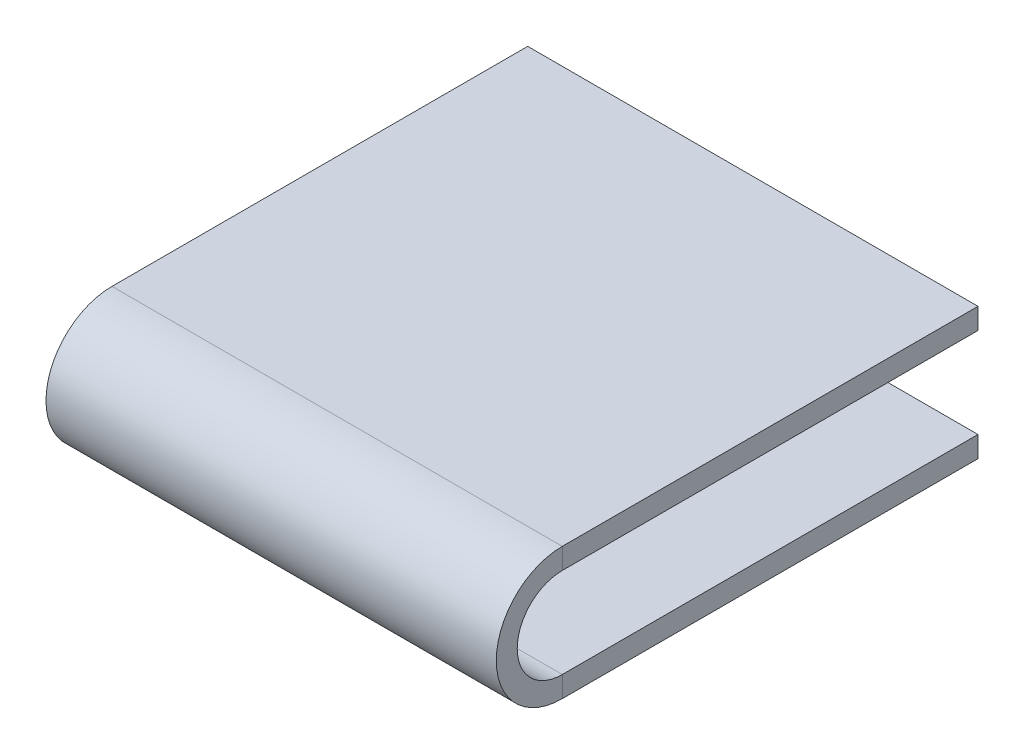
ISO-10303-21;
HEADER;
FILE_DESCRIPTION(('STEP AP214'),'2;1');
FILE_NAME('part.step','',(''),(''),'','','');
FILE_SCHEMA(('AUTOMOTIVE_DESIGN { 1 0 10303 214 1 1 1 1 }'));
ENDSEC;
DATA;
#1=APPLICATION_CONTEXT('core data for automotive mechanical design processes');
#2=APPLICATION_PROTOCOL_DEFINITION('international standard','automotive_design',2000,#1);
#3=PRODUCT_CONTEXT('',#1,'mechanical');
#4=PRODUCT('Part','Part','',(#3));
#5=PRODUCT_RELATED_PRODUCT_CATEGORY('part','',(#4));
#6=PRODUCT_DEFINITION_FORMATION('','',#4);
#7=PRODUCT_DEFINITION_CONTEXT('part definition',#1,'design');
#8=PRODUCT_DEFINITION('design','',#6,#7);
#9=PRODUCT_DEFINITION_SHAPE('','',#8);
#10=(LENGTH_UNIT() NAMED_UNIT(*) SI_UNIT(.MILLI.,.METRE.));
#11=(NAMED_UNIT(*) PLANE_ANGLE_UNIT() SI_UNIT($,.RADIAN.));
#12=(NAMED_UNIT(*) SI_UNIT($,.STERADIAN.) SOLID_ANGLE_UNIT());
#13=UNCERTAINTY_MEASURE_WITH_UNIT(LENGTH_MEASURE(1.E-05),#10,'distance_accuracy_value','');
#14=(GEOMETRIC_REPRESENTATION_CONTEXT(3) GLOBAL_UNCERTAINTY_ASSIGNED_CONTEXT((#13)) GLOBAL_UNIT_ASSIGNED_CONTEXT((#10,
#11,#12)) REPRESENTATION_CONTEXT('',''));
#15=CARTESIAN_POINT('',(0.,0.,0.));
#16=DIRECTION('',(0.,0.,1.));
#17=DIRECTION('',(1.,0.,0.));
#18=AXIS2_PLACEMENT_3D('',#15,#16,#17);
#19=CARTESIAN_POINT('',(21.5,0.,19.85));
#20=DIRECTION('',(1.,0.,0.));
#21=DIRECTION('',(0.,0.,-1.));
#22=AXIS2_PLACEMENT_3D('',#19,#20,#21);
#23=PLANE('',#22);
#24=DIRECTION('',(0.,-1.,0.));
#25=VECTOR('',#24,1.);
#26=CARTESIAN_POINT('',(21.5,0.,19.85));
#27=LINE('',#26,#25);
#28=CARTESIAN_POINT('',(21.5,0.,19.85));
#29=VERTEX_POINT('',#28);
#30=CARTESIAN_POINT('',(21.5,-1.,19.85));
#31=VERTEX_POINT('',#30);
#32=EDGE_CURVE('E11',#29,#31,#27,.T.);
#33=ORIENTED_EDGE('',*,*,#32,.F.);
#34=CARTESIAN_POINT('',(21.5,2.15,19.85));
#35=DIRECTION('',(1.,0.,0.));
#36=DIRECTION('',(0.,0.,-1.));
#37=AXIS2_PLACEMENT_3D('',#34,#35,#36);
#38=CIRCLE('',#37,2.15);
#39=CARTESIAN_POINT('',(21.5,4.29999999999999,19.85));
#40=VERTEX_POINT('',#39);
#41=EDGE_CURVE('E139',#40,#29,#38,.T.);
#42=ORIENTED_EDGE('',*,*,#41,.F.);
#43=DIRECTION('',(0.,-1.,0.));
#44=VECTOR('',#43,1.);
#45=CARTESIAN_POINT('',(21.5,5.29999999999999,19.85));
#46=LINE('',#45,#44);
#47=CARTESIAN_POINT('',(21.5,5.29999999999999,19.85));
#48=VERTEX_POINT('',#47);
#49=EDGE_CURVE('E51',#48,#40,#46,.T.);
#50=ORIENTED_EDGE('',*,*,#49,.F.);
#51=CARTESIAN_POINT('',(21.5,2.15,19.85));
#52=DIRECTION('',(1.,0.,0.));
#53=DIRECTION('',(0.,1.,0.));
#54=AXIS2_PLACEMENT_3D('',#51,#52,#53);
#55=CIRCLE('',#54,3.15);
#56=EDGE_CURVE('E132',#48,#31,#55,.T.);
#57=ORIENTED_EDGE('',*,*,#56,.T.);
#58=EDGE_LOOP('',(#33,#42,#50,#57));
#59=FACE_BOUND('',#58,.T.);
#60=ADVANCED_FACE('F43',(#59),#23,.T.);
#61=CARTESIAN_POINT('',(21.5,5.29999999999999,19.85));
#62=DIRECTION('',(1.,0.,0.));
#63=DIRECTION('',(0.,0.,-1.));
#64=AXIS2_PLACEMENT_3D('',#61,#62,#63);
#65=PLANE('',#64);
#66=DIRECTION('',(0.,0.,-1.));
#67=VECTOR('',#66,1.);
#68=CARTESIAN_POINT('',(21.5,0.,0.));
#69=LINE('',#68,#67);
#70=CARTESIAN_POINT('',(21.5,0.,0.));
#71=VERTEX_POINT('',#70);
#72=EDGE_CURVE('E188',#29,#71,#69,.T.);
#73=ORIENTED_EDGE('',*,*,#72,.F.);
#74=ORIENTED_EDGE('',*,*,#32,.T.);
#75=DIRECTION('',(0.,0.,1.));
#76=VECTOR('',#75,1.);
#77=CARTESIAN_POINT('',(21.5,-1.,0.));
#78=LINE('',#77,#76);
#79=CARTESIAN_POINT('',(21.5,-1.,0.));
#80=VERTEX_POINT('',#79);
#81=EDGE_CURVE('E97',#31,#80,#78,.F.);
#82=ORIENTED_EDGE('',*,*,#81,.T.);
#83=DIRECTION('',(0.,-1.,0.));
#84=VECTOR('',#83,1.);
#85=CARTESIAN_POINT('',(21.5,0.,0.));
#86=LINE('',#85,#84);
#87=EDGE_CURVE('E347',#71,#80,#86,.T.);
#88=ORIENTED_EDGE('',*,*,#87,.F.);
#89=EDGE_LOOP('',(#73,#74,#82,#88));
#90=FACE_BOUND('',#89,.T.);
#91=ADVANCED_FACE('F197',(#90),#65,.T.);
#92=CARTESIAN_POINT('',(0.,4.29999999999999,19.85));
#93=DIRECTION('',(-1.,0.,0.));
#94=DIRECTION('',(0.,0.,1.));
#95=AXIS2_PLACEMENT_3D('',#92,#93,#94);
#96=PLANE('',#95);
#97=DIRECTION('',(0.,1.,0.));
#98=VECTOR('',#97,1.);
#99=CARTESIAN_POINT('',(0.,4.29999999999999,19.85));
#100=LINE('',#99,#98);
#101=CARTESIAN_POINT('',(0.,4.29999999999999,19.85));
#102=VERTEX_POINT('',#101);
#103=CARTESIAN_POINT('',(0.,5.29999999999999,19.85));
#104=VERTEX_POINT('',#103);
#105=EDGE_CURVE('E88',#102,#104,#100,.T.);
#106=ORIENTED_EDGE('',*,*,#105,.F.);
#107=CARTESIAN_POINT('',(0.,2.15,19.85));
#108=DIRECTION('',(1.,0.,0.));
#109=DIRECTION('',(0.,0.,-1.));
#110=AXIS2_PLACEMENT_3D('',#107,#108,#109);
#111=CIRCLE('',#110,2.15);
#112=CARTESIAN_POINT('',(0.,0.,19.85));
#113=VERTEX_POINT('',#112);
#114=EDGE_CURVE('E154',#102,#113,#111,.T.);
#115=ORIENTED_EDGE('',*,*,#114,.T.);
#116=DIRECTION('',(0.,1.,0.));
#117=VECTOR('',#116,1.);
#118=CARTESIAN_POINT('',(0.,-1.,19.85));
#119=LINE('',#118,#117);
#120=CARTESIAN_POINT('',(0.,-1.,19.85));
#121=VERTEX_POINT('',#120);
#122=EDGE_CURVE('E91',#121,#113,#119,.T.);
#123=ORIENTED_EDGE('',*,*,#122,.F.);
#124=CARTESIAN_POINT('',(0.,2.15,19.85));
#125=DIRECTION('',(1.,0.,0.));
#126=DIRECTION('',(0.,1.,0.));
#127=AXIS2_PLACEMENT_3D('',#124,#125,#126);
#128=CIRCLE('',#127,3.15);
#129=EDGE_CURVE('E165',#104,#121,#128,.T.);
#130=ORIENTED_EDGE('',*,*,#129,.F.);
#131=EDGE_LOOP('',(#106,#115,#123,#130));
#132=FACE_BOUND('',#131,.T.);
#133=ADVANCED_FACE('F194',(#132),#96,.T.);
#134=CARTESIAN_POINT('',(0.,-1.,19.85));
#135=DIRECTION('',(-1.,0.,0.));
#136=DIRECTION('',(0.,0.,1.));
#137=AXIS2_PLACEMENT_3D('',#134,#135,#136);
#138=PLANE('',#137);
#139=DIRECTION('',(0.,0.,1.));
#140=VECTOR('',#139,1.);
#141=CARTESIAN_POINT('',(0.,4.3,0.));
#142=LINE('',#141,#140);
#143=CARTESIAN_POINT('',(0.,4.3,0.));
#144=VERTEX_POINT('',#143);
#145=EDGE_CURVE('E160',#144,#102,#142,.T.);
#146=ORIENTED_EDGE('',*,*,#145,.T.);
#147=ORIENTED_EDGE('',*,*,#105,.T.);
#148=DIRECTION('',(0.,0.,1.));
#149=VECTOR('',#148,1.);
#150=CARTESIAN_POINT('',(0.,5.3,0.));
#151=LINE('',#150,#149);
#152=CARTESIAN_POINT('',(0.,5.3,0.));
#153=VERTEX_POINT('',#152);
#154=EDGE_CURVE('E159',#153,#104,#151,.T.);
#155=ORIENTED_EDGE('',*,*,#154,.F.);
#156=DIRECTION('',(0.,-1.,0.));
#157=VECTOR('',#156,1.);
#158=CARTESIAN_POINT('',(0.,5.3,0.));
#159=LINE('',#158,#157);
#160=EDGE_CURVE('E122',#153,#144,#159,.T.);
#161=ORIENTED_EDGE('',*,*,#160,.T.);
#162=EDGE_LOOP('',(#146,#147,#155,#161));
#163=FACE_BOUND('',#162,.T.);
#164=ADVANCED_FACE('F191',(#163),#138,.T.);
#165=CARTESIAN_POINT('',(21.5,-1.,0.));
#166=DIRECTION('',(0.,1.,0.));
#167=DIRECTION('',(0.,0.,1.));
#168=AXIS2_PLACEMENT_3D('',#165,#166,#167);
#169=PLANE('',#168);
#170=DIRECTION('',(0.,0.,1.));
#171=VECTOR('',#170,1.);
#172=CARTESIAN_POINT('',(0.,-1.,0.));
#173=LINE('',#172,#171);
#174=CARTESIAN_POINT('',(0.,-1.,0.));
#175=VERTEX_POINT('',#174);
#176=EDGE_CURVE('E148',#121,#175,#173,.F.);
#177=ORIENTED_EDGE('',*,*,#176,.T.);
#178=DIRECTION('',(-1.,0.,0.));
#179=VECTOR('',#178,1.);
#180=CARTESIAN_POINT('',(21.5,-1.,0.));
#181=LINE('',#180,#179);
#182=EDGE_CURVE('E177',#80,#175,#181,.T.);
#183=ORIENTED_EDGE('',*,*,#182,.F.);
#184=ORIENTED_EDGE('',*,*,#81,.F.);
#185=DIRECTION('',(-1.,0.,0.));
#186=VECTOR('',#185,1.);
#187=CARTESIAN_POINT('',(21.5,-1.,19.85));
#188=LINE('',#187,#186);
#189=EDGE_CURVE('E144',#31,#121,#188,.T.);
#190=ORIENTED_EDGE('',*,*,#189,.T.);
#191=EDGE_LOOP('',(#177,#183,#184,#190));
#192=FACE_BOUND('',#191,.T.);
#193=ADVANCED_FACE('F201',(#192),#169,.F.);
#194=CARTESIAN_POINT('',(21.5,0.,0.));
#195=DIRECTION('',(0.,0.,-1.));
#196=DIRECTION('',(-1.,0.,0.));
#197=AXIS2_PLACEMENT_3D('',#194,#195,#196);
#198=PLANE('',#197);
#199=DIRECTION('',(0.,-1.,0.));
#200=VECTOR('',#199,1.);
#201=CARTESIAN_POINT('',(0.,0.,0.));
#202=LINE('',#201,#200);
#203=CARTESIAN_POINT('',(0.,0.,0.));
#204=VERTEX_POINT('',#203);
#205=EDGE_CURVE('E149',#204,#175,#202,.T.);
#206=ORIENTED_EDGE('',*,*,#205,.F.);
#207=DIRECTION('',(-1.,0.,0.));
#208=VECTOR('',#207,1.);
#209=CARTESIAN_POINT('',(21.5,0.,0.));
#210=LINE('',#209,#208);
#211=EDGE_CURVE('E173',#71,#204,#210,.T.);
#212=ORIENTED_EDGE('',*,*,#211,.F.);
#213=ORIENTED_EDGE('',*,*,#87,.T.);
#214=ORIENTED_EDGE('',*,*,#182,.T.);
#215=EDGE_LOOP('',(#206,#212,#213,#214));
#216=FACE_BOUND('',#215,.T.);
#217=ADVANCED_FACE('F237',(#216),#198,.T.);
#218=CARTESIAN_POINT('',(21.5,0.,0.));
#219=DIRECTION('',(0.,1.,0.));
#220=DIRECTION('',(0.,0.,1.));
#221=AXIS2_PLACEMENT_3D('',#218,#219,#220);
#222=PLANE('',#221);
#223=DIRECTION('',(0.,0.,-1.));
#224=VECTOR('',#223,1.);
#225=CARTESIAN_POINT('',(0.,0.,0.));
#226=LINE('',#225,#224);
#227=EDGE_CURVE('E155',#113,#204,#226,.T.);
#228=ORIENTED_EDGE('',*,*,#227,.F.);
#229=DIRECTION('',(-1.,0.,0.));
#230=VECTOR('',#229,1.);
#231=CARTESIAN_POINT('',(21.5,0.,19.85));
#232=LINE('',#231,#230);
#233=EDGE_CURVE('E171',#29,#113,#232,.T.);
#234=ORIENTED_EDGE('',*,*,#233,.F.);
#235=ORIENTED_EDGE('',*,*,#72,.T.);
#236=ORIENTED_EDGE('',*,*,#211,.T.);
#237=EDGE_LOOP('',(#228,#234,#235,#236));
#238=FACE_BOUND('',#237,.T.);
#239=ADVANCED_FACE('F250',(#238),#222,.T.);
#240=CARTESIAN_POINT('',(21.5,2.15,19.85));
#241=DIRECTION('',(-1.,0.,0.));
#242=DIRECTION('',(0.,0.,1.));
#243=AXIS2_PLACEMENT_3D('',#240,#241,#242);
#244=CYLINDRICAL_SURFACE('',#243,2.15);
#245=ORIENTED_EDGE('',*,*,#114,.F.);
#246=DIRECTION('',(-1.,0.,0.));
#247=VECTOR('',#246,1.);
#248=CARTESIAN_POINT('',(21.5,4.29999999999999,19.85));
#249=LINE('',#248,#247);
#250=EDGE_CURVE('E169',#40,#102,#249,.T.);
#251=ORIENTED_EDGE('',*,*,#250,.F.);
#252=ORIENTED_EDGE('',*,*,#41,.T.);
#253=ORIENTED_EDGE('',*,*,#233,.T.);
#254=EDGE_LOOP('',(#245,#251,#252,#253));
#255=FACE_BOUND('',#254,.T.);
#256=ADVANCED_FACE('F183',(#255),#244,.F.);
#257=CARTESIAN_POINT('',(21.5,4.3,0.));
#258=DIRECTION('',(0.,-1.,0.));
#259=DIRECTION('',(0.,0.,-1.));
#260=AXIS2_PLACEMENT_3D('',#257,#258,#259);
#261=PLANE('',#260);
#262=ORIENTED_EDGE('',*,*,#145,.F.);
#263=DIRECTION('',(-1.,0.,0.));
#264=VECTOR('',#263,1.);
#265=CARTESIAN_POINT('',(21.5,4.3,0.));
#266=LINE('',#265,#264);
#267=CARTESIAN_POINT('',(21.5,4.3,0.));
#268=VERTEX_POINT('',#267);
#269=EDGE_CURVE('E123',#268,#144,#266,.T.);
#270=ORIENTED_EDGE('',*,*,#269,.F.);
#271=DIRECTION('',(0.,0.,1.));
#272=VECTOR('',#271,1.);
#273=CARTESIAN_POINT('',(21.5,4.3,0.));
#274=LINE('',#273,#272);
#275=EDGE_CURVE('E138',#268,#40,#274,.T.);
#276=ORIENTED_EDGE('',*,*,#275,.T.);
#277=ORIENTED_EDGE('',*,*,#250,.T.);
#278=EDGE_LOOP('',(#262,#270,#276,#277));
#279=FACE_BOUND('',#278,.T.);
#280=ADVANCED_FACE('F189',(#279),#261,.T.);
#281=CARTESIAN_POINT('',(21.5,5.3,0.));
#282=DIRECTION('',(0.,0.,-1.));
#283=DIRECTION('',(0.,1.,0.));
#284=AXIS2_PLACEMENT_3D('',#281,#282,#283);
#285=PLANE('',#284);
#286=ORIENTED_EDGE('',*,*,#160,.F.);
#287=DIRECTION('',(-1.,0.,0.));
#288=VECTOR('',#287,1.);
#289=CARTESIAN_POINT('',(21.5,5.3,0.));
#290=LINE('',#289,#288);
#291=CARTESIAN_POINT('',(21.5,5.3,0.));
#292=VERTEX_POINT('',#291);
#293=EDGE_CURVE('E113',#292,#153,#290,.T.);
#294=ORIENTED_EDGE('',*,*,#293,.F.);
#295=DIRECTION('',(0.,-1.,0.));
#296=VECTOR('',#295,1.);
#297=CARTESIAN_POINT('',(21.5,5.3,0.));
#298=LINE('',#297,#296);
#299=EDGE_CURVE('E118',#292,#268,#298,.T.);
#300=ORIENTED_EDGE('',*,*,#299,.T.);
#301=ORIENTED_EDGE('',*,*,#269,.T.);
#302=EDGE_LOOP('',(#286,#294,#300,#301));
#303=FACE_BOUND('',#302,.T.);
#304=ADVANCED_FACE('F120',(#303),#285,.T.);
#305=CARTESIAN_POINT('',(21.5,5.3,0.));
#306=DIRECTION('',(0.,-1.,0.));
#307=DIRECTION('',(0.,0.,-1.));
#308=AXIS2_PLACEMENT_3D('',#305,#306,#307);
#309=PLANE('',#308);
#310=ORIENTED_EDGE('',*,*,#154,.T.);
#311=DIRECTION('',(-1.,0.,0.));
#312=VECTOR('',#311,1.);
#313=CARTESIAN_POINT('',(21.5,5.29999999999999,19.85));
#314=LINE('',#313,#312);
#315=EDGE_CURVE('E124',#48,#104,#314,.T.);
#316=ORIENTED_EDGE('',*,*,#315,.F.);
#317=DIRECTION('',(0.,0.,1.));
#318=VECTOR('',#317,1.);
#319=CARTESIAN_POINT('',(21.5,5.3,0.));
#320=LINE('',#319,#318);
#321=EDGE_CURVE('E126',#292,#48,#320,.T.);
#322=ORIENTED_EDGE('',*,*,#321,.F.);
#323=ORIENTED_EDGE('',*,*,#293,.T.);
#324=EDGE_LOOP('',(#310,#316,#322,#323));
#325=FACE_BOUND('',#324,.T.);
#326=ADVANCED_FACE('F129',(#325),#309,.F.);
#327=CARTESIAN_POINT('',(21.5,2.15,19.85));
#328=DIRECTION('',(-1.,0.,0.));
#329=DIRECTION('',(0.,0.,1.));
#330=AXIS2_PLACEMENT_3D('',#327,#328,#329);
#331=CYLINDRICAL_SURFACE('',#330,3.15);
#332=ORIENTED_EDGE('',*,*,#129,.T.);
#333=ORIENTED_EDGE('',*,*,#189,.F.);
#334=ORIENTED_EDGE('',*,*,#56,.F.);
#335=ORIENTED_EDGE('',*,*,#315,.T.);
#336=EDGE_LOOP('',(#332,#333,#334,#335));
#337=FACE_BOUND('',#336,.T.);
#338=ADVANCED_FACE('F193',(#337),#331,.T.);
#339=CARTESIAN_POINT('',(21.5,2.15,19.85));
#340=DIRECTION('',(1.,0.,0.));
#341=DIRECTION('',(0.,1.,0.));
#342=AXIS2_PLACEMENT_3D('',#339,#340,#341);
#343=PLANE('',#342);
#344=ORIENTED_EDGE('',*,*,#321,.T.);
#345=ORIENTED_EDGE('',*,*,#49,.T.);
#346=ORIENTED_EDGE('',*,*,#275,.F.);
#347=ORIENTED_EDGE('',*,*,#299,.F.);
#348=EDGE_LOOP('',(#344,#345,#346,#347));
#349=FACE_BOUND('',#348,.T.);
#350=ADVANCED_FACE('F136',(#349),#343,.T.);
#351=CARTESIAN_POINT('',(0.,2.15,19.85));
#352=DIRECTION('',(1.,0.,0.));
#353=DIRECTION('',(0.,1.,0.));
#354=AXIS2_PLACEMENT_3D('',#351,#352,#353);
#355=PLANE('',#354);
#356=ORIENTED_EDGE('',*,*,#176,.F.);
#357=ORIENTED_EDGE('',*,*,#122,.T.);
#358=ORIENTED_EDGE('',*,*,#227,.T.);
#359=ORIENTED_EDGE('',*,*,#205,.T.);
#360=EDGE_LOOP('',(#356,#357,#358,#359));
#361=FACE_BOUND('',#360,.T.);
#362=ADVANCED_FACE('F311',(#361),#355,.F.);
#363=CLOSED_SHELL('',(#60,#91,#133,#164,#193,#217,#239,#256,#280,#304,#326,#338,#350,#362));
#364=MANIFOLD_SOLID_BREP('B2',#363);
#365=ADVANCED_BREP_SHAPE_REPRESENTATION('',(#18,#364),#14);
#366=SHAPE_DEFINITION_REPRESENTATION(#9,#365);
ENDSEC;
END-ISO-10303-21;
